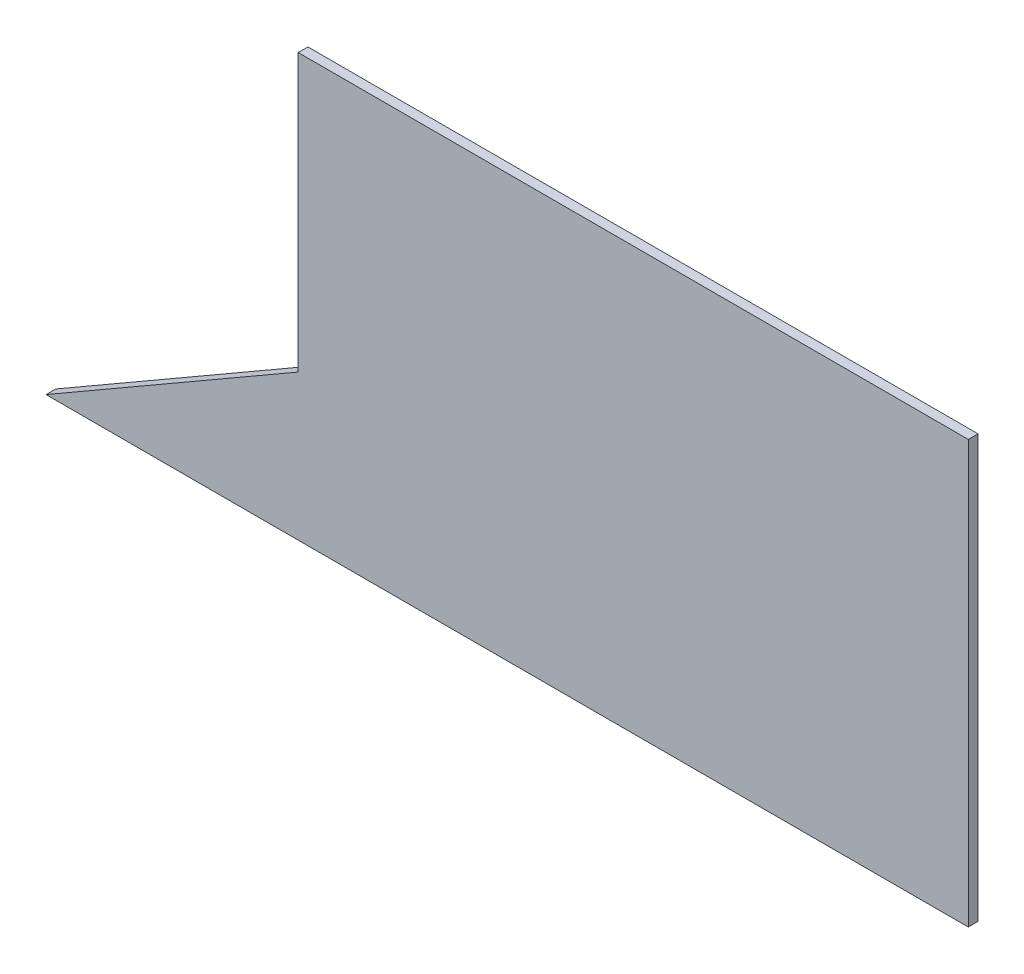
ISO-10303-21;
HEADER;
FILE_DESCRIPTION(('STEP AP214'),'2;1');
FILE_NAME('part.step','',(''),(''),'','','');
FILE_SCHEMA(('AUTOMOTIVE_DESIGN { 1 0 10303 214 1 1 1 1 }'));
ENDSEC;
DATA;
#1=APPLICATION_CONTEXT('core data for automotive mechanical design processes');
#2=APPLICATION_PROTOCOL_DEFINITION('international standard','automotive_design',2000,#1);
#3=PRODUCT_CONTEXT('',#1,'mechanical');
#4=PRODUCT('Part','Part','',(#3));
#5=PRODUCT_RELATED_PRODUCT_CATEGORY('part','',(#4));
#6=PRODUCT_DEFINITION_FORMATION('','',#4);
#7=PRODUCT_DEFINITION_CONTEXT('part definition',#1,'design');
#8=PRODUCT_DEFINITION('design','',#6,#7);
#9=PRODUCT_DEFINITION_SHAPE('','',#8);
#10=(LENGTH_UNIT() NAMED_UNIT(*) SI_UNIT(.MILLI.,.METRE.));
#11=(NAMED_UNIT(*) PLANE_ANGLE_UNIT() SI_UNIT($,.RADIAN.));
#12=(NAMED_UNIT(*) SI_UNIT($,.STERADIAN.) SOLID_ANGLE_UNIT());
#13=UNCERTAINTY_MEASURE_WITH_UNIT(LENGTH_MEASURE(1.E-05),#10,'distance_accuracy_value','');
#14=(GEOMETRIC_REPRESENTATION_CONTEXT(3) GLOBAL_UNCERTAINTY_ASSIGNED_CONTEXT((#13)) GLOBAL_UNIT_ASSIGNED_CONTEXT((#10,
#11,#12)) REPRESENTATION_CONTEXT('',''));
#15=CARTESIAN_POINT('',(0.,0.,0.));
#16=DIRECTION('',(0.,0.,1.));
#17=DIRECTION('',(1.,0.,0.));
#18=AXIS2_PLACEMENT_3D('',#15,#16,#17);
#19=CARTESIAN_POINT('',(-30.6813329157897,-11.6309523809544,2.));
#20=DIRECTION('',(0.499999999999995,-0.866025403784441,0.));
#21=DIRECTION('',(0.866025403784442,0.499999999999995,0.));
#22=AXIS2_PLACEMENT_3D('',#19,#20,#21);
#23=PLANE('',#22);
#24=DIRECTION('',(-0.866025403784441,-0.499999999999995,0.));
#25=VECTOR('',#24,1.);
#26=CARTESIAN_POINT('',(-30.6813329157897,-11.6309523809544,0.));
#27=LINE('',#26,#25);
#28=CARTESIAN_POINT('',(-30.6813329157897,-11.6309523809544,0.));
#29=VERTEX_POINT('',#28);
#30=CARTESIAN_POINT('',(-82.6428571428562,-41.6309523809541,0.));
#31=VERTEX_POINT('',#30);
#32=EDGE_CURVE('E112',#29,#31,#27,.T.);
#33=ORIENTED_EDGE('',*,*,#32,.T.);
#34=DIRECTION('',(0.,0.,-1.));
#35=VECTOR('',#34,1.);
#36=CARTESIAN_POINT('',(-82.6428571428562,-41.6309523809541,2.));
#37=LINE('',#36,#35);
#38=CARTESIAN_POINT('',(-82.6428571428562,-41.6309523809541,2.));
#39=VERTEX_POINT('',#38);
#40=EDGE_CURVE('E11',#39,#31,#37,.T.);
#41=ORIENTED_EDGE('',*,*,#40,.F.);
#42=DIRECTION('',(-0.866025403784441,-0.499999999999995,0.));
#43=VECTOR('',#42,1.);
#44=CARTESIAN_POINT('',(-30.6813329157897,-11.6309523809544,2.));
#45=LINE('',#44,#43);
#46=CARTESIAN_POINT('',(-30.6813329157897,-11.6309523809544,2.));
#47=VERTEX_POINT('',#46);
#48=EDGE_CURVE('E120',#47,#39,#45,.T.);
#49=ORIENTED_EDGE('',*,*,#48,.F.);
#50=DIRECTION('',(0.,0.,-1.));
#51=VECTOR('',#50,1.);
#52=CARTESIAN_POINT('',(-30.6813329157897,-11.6309523809544,2.));
#53=LINE('',#52,#51);
#54=EDGE_CURVE('E108',#47,#29,#53,.T.);
#55=ORIENTED_EDGE('',*,*,#54,.T.);
#56=EDGE_LOOP('',(#33,#41,#49,#55));
#57=FACE_BOUND('',#56,.T.);
#58=ADVANCED_FACE('F38',(#57),#23,.F.);
#59=CARTESIAN_POINT('',(-82.6428571428562,-41.6309523809541,2.));
#60=DIRECTION('',(0.,1.,0.));
#61=DIRECTION('',(-1.,0.,0.));
#62=AXIS2_PLACEMENT_3D('',#59,#60,#61);
#63=PLANE('',#62);
#64=DIRECTION('',(1.,0.,0.));
#65=VECTOR('',#64,1.);
#66=CARTESIAN_POINT('',(-82.6428571428562,-41.6309523809541,0.));
#67=LINE('',#66,#65);
#68=CARTESIAN_POINT('',(107.357142857144,-41.6309523809541,0.));
#69=VERTEX_POINT('',#68);
#70=EDGE_CURVE('E115',#31,#69,#67,.T.);
#71=ORIENTED_EDGE('',*,*,#70,.T.);
#72=DIRECTION('',(0.,0.,-1.));
#73=VECTOR('',#72,1.);
#74=CARTESIAN_POINT('',(107.357142857144,-41.6309523809541,2.));
#75=LINE('',#74,#73);
#76=CARTESIAN_POINT('',(107.357142857144,-41.6309523809541,2.));
#77=VERTEX_POINT('',#76);
#78=EDGE_CURVE('E46',#77,#69,#75,.T.);
#79=ORIENTED_EDGE('',*,*,#78,.F.);
#80=DIRECTION('',(1.,0.,0.));
#81=VECTOR('',#80,1.);
#82=CARTESIAN_POINT('',(-82.6428571428562,-41.6309523809541,2.));
#83=LINE('',#82,#81);
#84=EDGE_CURVE('E88',#39,#77,#83,.T.);
#85=ORIENTED_EDGE('',*,*,#84,.F.);
#86=ORIENTED_EDGE('',*,*,#40,.T.);
#87=EDGE_LOOP('',(#71,#79,#85,#86));
#88=FACE_BOUND('',#87,.T.);
#89=ADVANCED_FACE('F139',(#88),#63,.F.);
#90=CARTESIAN_POINT('',(107.357142857144,-41.6309523809541,2.));
#91=DIRECTION('',(-1.,0.,0.));
#92=DIRECTION('',(0.,0.,1.));
#93=AXIS2_PLACEMENT_3D('',#90,#91,#92);
#94=PLANE('',#93);
#95=DIRECTION('',(0.,1.,0.));
#96=VECTOR('',#95,1.);
#97=CARTESIAN_POINT('',(107.357142857144,-41.6309523809541,0.));
#98=LINE('',#97,#96);
#99=CARTESIAN_POINT('',(107.357142857144,45.3690476190459,0.));
#100=VERTEX_POINT('',#99);
#101=EDGE_CURVE('E103',#69,#100,#98,.T.);
#102=ORIENTED_EDGE('',*,*,#101,.T.);
#103=DIRECTION('',(0.,0.,-1.));
#104=VECTOR('',#103,1.);
#105=CARTESIAN_POINT('',(107.357142857144,45.3690476190459,2.));
#106=LINE('',#105,#104);
#107=CARTESIAN_POINT('',(107.357142857144,45.3690476190459,2.));
#108=VERTEX_POINT('',#107);
#109=EDGE_CURVE('E100',#108,#100,#106,.T.);
#110=ORIENTED_EDGE('',*,*,#109,.F.);
#111=DIRECTION('',(0.,1.,0.));
#112=VECTOR('',#111,1.);
#113=CARTESIAN_POINT('',(107.357142857144,-41.6309523809541,2.));
#114=LINE('',#113,#112);
#115=EDGE_CURVE('E92',#77,#108,#114,.T.);
#116=ORIENTED_EDGE('',*,*,#115,.F.);
#117=ORIENTED_EDGE('',*,*,#78,.T.);
#118=EDGE_LOOP('',(#102,#110,#116,#117));
#119=FACE_BOUND('',#118,.T.);
#120=ADVANCED_FACE('F101',(#119),#94,.F.);
#121=CARTESIAN_POINT('',(107.357142857144,45.3690476190459,2.));
#122=DIRECTION('',(0.,-1.,0.));
#123=DIRECTION('',(1.,0.,0.));
#124=AXIS2_PLACEMENT_3D('',#121,#122,#123);
#125=PLANE('',#124);
#126=DIRECTION('',(-1.,0.,0.));
#127=VECTOR('',#126,1.);
#128=CARTESIAN_POINT('',(107.357142857144,45.3690476190459,0.));
#129=LINE('',#128,#127);
#130=CARTESIAN_POINT('',(-30.6813329157897,45.3690476190458,0.));
#131=VERTEX_POINT('',#130);
#132=EDGE_CURVE('E74',#100,#131,#129,.T.);
#133=ORIENTED_EDGE('',*,*,#132,.T.);
#134=DIRECTION('',(0.,0.,-1.));
#135=VECTOR('',#134,1.);
#136=CARTESIAN_POINT('',(-30.6813329157897,45.3690476190458,2.));
#137=LINE('',#136,#135);
#138=CARTESIAN_POINT('',(-30.6813329157897,45.3690476190458,2.));
#139=VERTEX_POINT('',#138);
#140=EDGE_CURVE('E104',#139,#131,#137,.T.);
#141=ORIENTED_EDGE('',*,*,#140,.F.);
#142=DIRECTION('',(-1.,0.,0.));
#143=VECTOR('',#142,1.);
#144=CARTESIAN_POINT('',(107.357142857144,45.3690476190459,2.));
#145=LINE('',#144,#143);
#146=EDGE_CURVE('E96',#108,#139,#145,.T.);
#147=ORIENTED_EDGE('',*,*,#146,.F.);
#148=ORIENTED_EDGE('',*,*,#109,.T.);
#149=EDGE_LOOP('',(#133,#141,#147,#148));
#150=FACE_BOUND('',#149,.T.);
#151=ADVANCED_FACE('F106',(#150),#125,.F.);
#152=CARTESIAN_POINT('',(-30.6813329157897,45.3690476190458,2.));
#153=DIRECTION('',(1.,0.,0.));
#154=DIRECTION('',(0.,0.,-1.));
#155=AXIS2_PLACEMENT_3D('',#152,#153,#154);
#156=PLANE('',#155);
#157=DIRECTION('',(0.,-1.,0.));
#158=VECTOR('',#157,1.);
#159=CARTESIAN_POINT('',(-30.6813329157897,45.3690476190458,0.));
#160=LINE('',#159,#158);
#161=EDGE_CURVE('E80',#131,#29,#160,.T.);
#162=ORIENTED_EDGE('',*,*,#161,.T.);
#163=ORIENTED_EDGE('',*,*,#54,.F.);
#164=DIRECTION('',(0.,-1.,0.));
#165=VECTOR('',#164,1.);
#166=CARTESIAN_POINT('',(-30.6813329157897,45.3690476190458,2.));
#167=LINE('',#166,#165);
#168=EDGE_CURVE('E54',#139,#47,#167,.T.);
#169=ORIENTED_EDGE('',*,*,#168,.F.);
#170=ORIENTED_EDGE('',*,*,#140,.T.);
#171=EDGE_LOOP('',(#162,#163,#169,#170));
#172=FACE_BOUND('',#171,.T.);
#173=ADVANCED_FACE('F128',(#172),#156,.F.);
#174=CARTESIAN_POINT('',(0.,0.,2.));
#175=DIRECTION('',(0.,0.,-1.));
#176=DIRECTION('',(-1.,0.,0.));
#177=AXIS2_PLACEMENT_3D('',#174,#175,#176);
#178=PLANE('',#177);
#179=ORIENTED_EDGE('',*,*,#48,.T.);
#180=ORIENTED_EDGE('',*,*,#84,.T.);
#181=ORIENTED_EDGE('',*,*,#115,.T.);
#182=ORIENTED_EDGE('',*,*,#146,.T.);
#183=ORIENTED_EDGE('',*,*,#168,.T.);
#184=EDGE_LOOP('',(#179,#180,#181,#182,#183));
#185=FACE_BOUND('',#184,.T.);
#186=ADVANCED_FACE('F94',(#185),#178,.F.);
#187=CARTESIAN_POINT('',(0.,0.,0.));
#188=DIRECTION('',(0.,0.,-1.));
#189=DIRECTION('',(-1.,0.,0.));
#190=AXIS2_PLACEMENT_3D('',#187,#188,#189);
#191=PLANE('',#190);
#192=ORIENTED_EDGE('',*,*,#32,.F.);
#193=ORIENTED_EDGE('',*,*,#161,.F.);
#194=ORIENTED_EDGE('',*,*,#132,.F.);
#195=ORIENTED_EDGE('',*,*,#101,.F.);
#196=ORIENTED_EDGE('',*,*,#70,.F.);
#197=EDGE_LOOP('',(#192,#193,#194,#195,#196));
#198=FACE_BOUND('',#197,.T.);
#199=ADVANCED_FACE('F124',(#198),#191,.T.);
#200=CLOSED_SHELL('',(#58,#89,#120,#151,#173,#186,#199));
#201=MANIFOLD_SOLID_BREP('B2',#200);
#202=ADVANCED_BREP_SHAPE_REPRESENTATION('',(#18,#201),#14);
#203=SHAPE_DEFINITION_REPRESENTATION(#9,#202);
ENDSEC;
END-ISO-10303-21;
